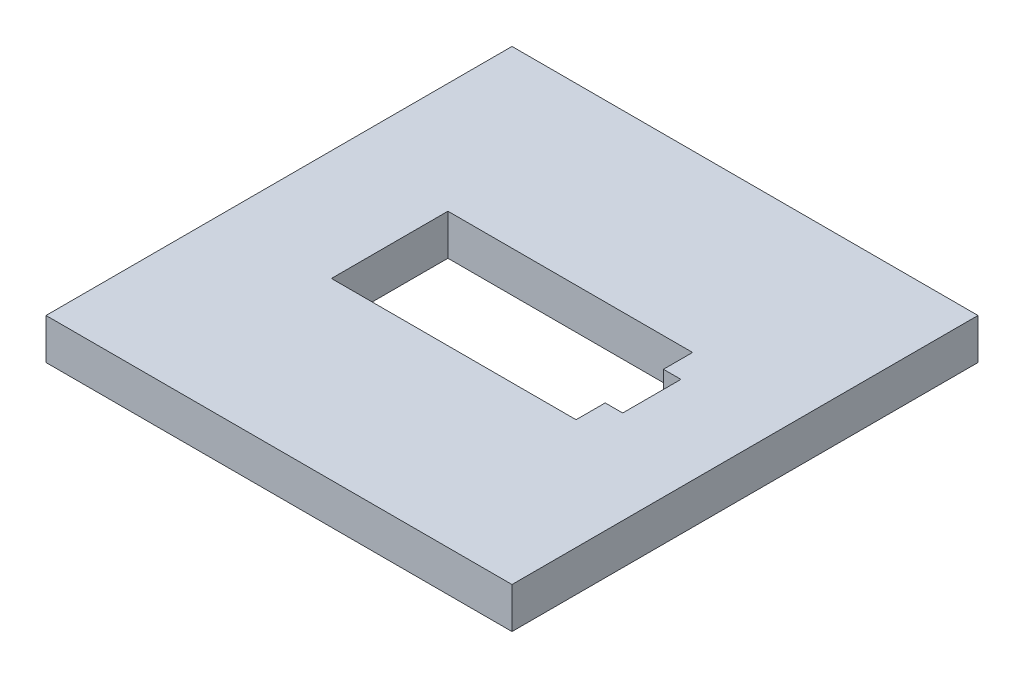
ISO-10303-21;
HEADER;
FILE_DESCRIPTION(('STEP AP214'),'2;1');
FILE_NAME('part.step','',(''),(''),'','','');
FILE_SCHEMA(('AUTOMOTIVE_DESIGN { 1 0 10303 214 1 1 1 1 }'));
ENDSEC;
DATA;
#1=APPLICATION_CONTEXT('core data for automotive mechanical design processes');
#2=APPLICATION_PROTOCOL_DEFINITION('international standard','automotive_design',2000,#1);
#3=PRODUCT_CONTEXT('',#1,'mechanical');
#4=PRODUCT('Part','Part','',(#3));
#5=PRODUCT_RELATED_PRODUCT_CATEGORY('part','',(#4));
#6=PRODUCT_DEFINITION_FORMATION('','',#4);
#7=PRODUCT_DEFINITION_CONTEXT('part definition',#1,'design');
#8=PRODUCT_DEFINITION('design','',#6,#7);
#9=PRODUCT_DEFINITION_SHAPE('','',#8);
#10=(LENGTH_UNIT() NAMED_UNIT(*) SI_UNIT(.MILLI.,.METRE.));
#11=(NAMED_UNIT(*) PLANE_ANGLE_UNIT() SI_UNIT($,.RADIAN.));
#12=(NAMED_UNIT(*) SI_UNIT($,.STERADIAN.) SOLID_ANGLE_UNIT());
#13=UNCERTAINTY_MEASURE_WITH_UNIT(LENGTH_MEASURE(1.E-05),#10,'distance_accuracy_value','');
#14=(GEOMETRIC_REPRESENTATION_CONTEXT(3) GLOBAL_UNCERTAINTY_ASSIGNED_CONTEXT((#13)) GLOBAL_UNIT_ASSIGNED_CONTEXT((#10,
#11,#12)) REPRESENTATION_CONTEXT('',''));
#15=CARTESIAN_POINT('',(0.,0.,0.));
#16=DIRECTION('',(0.,0.,1.));
#17=DIRECTION('',(1.,0.,0.));
#18=AXIS2_PLACEMENT_3D('',#15,#16,#17);
#19=CARTESIAN_POINT('',(40.,7.,40.));
#20=DIRECTION('',(-1.,0.,0.));
#21=DIRECTION('',(0.,0.,1.));
#22=AXIS2_PLACEMENT_3D('',#19,#20,#21);
#23=PLANE('',#22);
#24=DIRECTION('',(0.,0.,-1.));
#25=VECTOR('',#24,1.);
#26=CARTESIAN_POINT('',(40.,0.,40.));
#27=LINE('',#26,#25);
#28=CARTESIAN_POINT('',(40.,0.,40.));
#29=VERTEX_POINT('',#28);
#30=CARTESIAN_POINT('',(40.,0.,-40.));
#31=VERTEX_POINT('',#30);
#32=EDGE_CURVE('E184',#29,#31,#27,.T.);
#33=ORIENTED_EDGE('',*,*,#32,.T.);
#34=DIRECTION('',(0.,-1.,0.));
#35=VECTOR('',#34,1.);
#36=CARTESIAN_POINT('',(40.,7.,-40.));
#37=LINE('',#36,#35);
#38=CARTESIAN_POINT('',(40.,7.,-40.));
#39=VERTEX_POINT('',#38);
#40=EDGE_CURVE('E11',#39,#31,#37,.T.);
#41=ORIENTED_EDGE('',*,*,#40,.F.);
#42=DIRECTION('',(0.,0.,-1.));
#43=VECTOR('',#42,1.);
#44=CARTESIAN_POINT('',(40.,7.,40.));
#45=LINE('',#44,#43);
#46=CARTESIAN_POINT('',(40.,7.,40.));
#47=VERTEX_POINT('',#46);
#48=EDGE_CURVE('E196',#47,#39,#45,.T.);
#49=ORIENTED_EDGE('',*,*,#48,.F.);
#50=DIRECTION('',(0.,-1.,0.));
#51=VECTOR('',#50,1.);
#52=CARTESIAN_POINT('',(40.,7.,40.));
#53=LINE('',#52,#51);
#54=EDGE_CURVE('E206',#47,#29,#53,.T.);
#55=ORIENTED_EDGE('',*,*,#54,.T.);
#56=EDGE_LOOP('',(#33,#41,#49,#55));
#57=FACE_BOUND('',#56,.T.);
#58=ADVANCED_FACE('F39',(#57),#23,.F.);
#59=CARTESIAN_POINT('',(-40.,7.,-40.));
#60=DIRECTION('',(0.,0.,1.));
#61=DIRECTION('',(1.,0.,0.));
#62=AXIS2_PLACEMENT_3D('',#59,#60,#61);
#63=PLANE('',#62);
#64=DIRECTION('',(-1.,0.,0.));
#65=VECTOR('',#64,1.);
#66=CARTESIAN_POINT('',(-40.,0.,-40.));
#67=LINE('',#66,#65);
#68=CARTESIAN_POINT('',(-40.,0.,-40.));
#69=VERTEX_POINT('',#68);
#70=EDGE_CURVE('E209',#31,#69,#67,.T.);
#71=ORIENTED_EDGE('',*,*,#70,.T.);
#72=DIRECTION('',(0.,-1.,0.));
#73=VECTOR('',#72,1.);
#74=CARTESIAN_POINT('',(-40.,7.,-40.));
#75=LINE('',#74,#73);
#76=CARTESIAN_POINT('',(-40.,7.,-40.));
#77=VERTEX_POINT('',#76);
#78=EDGE_CURVE('E46',#77,#69,#75,.T.);
#79=ORIENTED_EDGE('',*,*,#78,.F.);
#80=DIRECTION('',(-1.,0.,0.));
#81=VECTOR('',#80,1.);
#82=CARTESIAN_POINT('',(-40.,7.,-40.));
#83=LINE('',#82,#81);
#84=EDGE_CURVE('E199',#39,#77,#83,.T.);
#85=ORIENTED_EDGE('',*,*,#84,.F.);
#86=ORIENTED_EDGE('',*,*,#40,.T.);
#87=EDGE_LOOP('',(#71,#79,#85,#86));
#88=FACE_BOUND('',#87,.T.);
#89=ADVANCED_FACE('F237',(#88),#63,.F.);
#90=CARTESIAN_POINT('',(-40.,7.,40.));
#91=DIRECTION('',(1.,0.,0.));
#92=DIRECTION('',(0.,0.,-1.));
#93=AXIS2_PLACEMENT_3D('',#90,#91,#92);
#94=PLANE('',#93);
#95=DIRECTION('',(0.,0.,1.));
#96=VECTOR('',#95,1.);
#97=CARTESIAN_POINT('',(-40.,0.,40.));
#98=LINE('',#97,#96);
#99=CARTESIAN_POINT('',(-40.,0.,40.));
#100=VERTEX_POINT('',#99);
#101=EDGE_CURVE('E211',#69,#100,#98,.T.);
#102=ORIENTED_EDGE('',*,*,#101,.T.);
#103=DIRECTION('',(0.,-1.,0.));
#104=VECTOR('',#103,1.);
#105=CARTESIAN_POINT('',(-40.,7.,40.));
#106=LINE('',#105,#104);
#107=CARTESIAN_POINT('',(-40.,7.,40.));
#108=VERTEX_POINT('',#107);
#109=EDGE_CURVE('E216',#108,#100,#106,.T.);
#110=ORIENTED_EDGE('',*,*,#109,.F.);
#111=DIRECTION('',(0.,0.,1.));
#112=VECTOR('',#111,1.);
#113=CARTESIAN_POINT('',(-40.,7.,40.));
#114=LINE('',#113,#112);
#115=EDGE_CURVE('E202',#77,#108,#114,.T.);
#116=ORIENTED_EDGE('',*,*,#115,.F.);
#117=ORIENTED_EDGE('',*,*,#78,.T.);
#118=EDGE_LOOP('',(#102,#110,#116,#117));
#119=FACE_BOUND('',#118,.T.);
#120=ADVANCED_FACE('F223',(#119),#94,.F.);
#121=CARTESIAN_POINT('',(-40.,7.,40.));
#122=DIRECTION('',(0.,0.,-1.));
#123=DIRECTION('',(-1.,0.,0.));
#124=AXIS2_PLACEMENT_3D('',#121,#122,#123);
#125=PLANE('',#124);
#126=DIRECTION('',(1.,0.,0.));
#127=VECTOR('',#126,1.);
#128=CARTESIAN_POINT('',(-40.,0.,40.));
#129=LINE('',#128,#127);
#130=EDGE_CURVE('E200',#100,#29,#129,.T.);
#131=ORIENTED_EDGE('',*,*,#130,.T.);
#132=ORIENTED_EDGE('',*,*,#54,.F.);
#133=DIRECTION('',(1.,0.,0.));
#134=VECTOR('',#133,1.);
#135=CARTESIAN_POINT('',(-40.,7.,40.));
#136=LINE('',#135,#134);
#137=EDGE_CURVE('E204',#108,#47,#136,.T.);
#138=ORIENTED_EDGE('',*,*,#137,.F.);
#139=ORIENTED_EDGE('',*,*,#109,.T.);
#140=EDGE_LOOP('',(#131,#132,#138,#139));
#141=FACE_BOUND('',#140,.T.);
#142=ADVANCED_FACE('F230',(#141),#125,.F.);
#143=CARTESIAN_POINT('',(0.,7.,0.));
#144=DIRECTION('',(0.,-1.,0.));
#145=DIRECTION('',(0.,0.,-1.));
#146=AXIS2_PLACEMENT_3D('',#143,#144,#145);
#147=PLANE('',#146);
#148=DIRECTION('',(-1.,0.,0.));
#149=VECTOR('',#148,1.);
#150=CARTESIAN_POINT('',(-21.,7.,-10.));
#151=LINE('',#150,#149);
#152=CARTESIAN_POINT('',(21.,7.,-10.));
#153=VERTEX_POINT('',#152);
#154=CARTESIAN_POINT('',(-21.,7.,-10.));
#155=VERTEX_POINT('',#154);
#156=EDGE_CURVE('E166',#153,#155,#151,.T.);
#157=ORIENTED_EDGE('',*,*,#156,.F.);
#158=DIRECTION('',(0.,0.,-1.));
#159=VECTOR('',#158,1.);
#160=CARTESIAN_POINT('',(21.,7.,-5.));
#161=LINE('',#160,#159);
#162=CARTESIAN_POINT('',(21.,7.,-5.));
#163=VERTEX_POINT('',#162);
#164=EDGE_CURVE('E53',#163,#153,#161,.T.);
#165=ORIENTED_EDGE('',*,*,#164,.F.);
#166=DIRECTION('',(-1.,0.,0.));
#167=VECTOR('',#166,1.);
#168=CARTESIAN_POINT('',(21.,7.,-5.));
#169=LINE('',#168,#167);
#170=CARTESIAN_POINT('',(24.,7.,-5.));
#171=VERTEX_POINT('',#170);
#172=EDGE_CURVE('E146',#171,#163,#169,.T.);
#173=ORIENTED_EDGE('',*,*,#172,.F.);
#174=DIRECTION('',(0.,0.,-1.));
#175=VECTOR('',#174,1.);
#176=CARTESIAN_POINT('',(24.,7.,-5.));
#177=LINE('',#176,#175);
#178=CARTESIAN_POINT('',(24.,7.,5.));
#179=VERTEX_POINT('',#178);
#180=EDGE_CURVE('E149',#179,#171,#177,.T.);
#181=ORIENTED_EDGE('',*,*,#180,.F.);
#182=DIRECTION('',(1.,0.,0.));
#183=VECTOR('',#182,1.);
#184=CARTESIAN_POINT('',(24.,7.,5.));
#185=LINE('',#184,#183);
#186=CARTESIAN_POINT('',(21.,7.,5.));
#187=VERTEX_POINT('',#186);
#188=EDGE_CURVE('E177',#187,#179,#185,.T.);
#189=ORIENTED_EDGE('',*,*,#188,.F.);
#190=DIRECTION('',(0.,0.,-1.));
#191=VECTOR('',#190,1.);
#192=CARTESIAN_POINT('',(21.,7.,10.));
#193=LINE('',#192,#191);
#194=CARTESIAN_POINT('',(21.,7.,10.));
#195=VERTEX_POINT('',#194);
#196=EDGE_CURVE('E174',#195,#187,#193,.T.);
#197=ORIENTED_EDGE('',*,*,#196,.F.);
#198=DIRECTION('',(1.,0.,0.));
#199=VECTOR('',#198,1.);
#200=CARTESIAN_POINT('',(-21.,7.,10.));
#201=LINE('',#200,#199);
#202=CARTESIAN_POINT('',(-21.,7.,10.));
#203=VERTEX_POINT('',#202);
#204=EDGE_CURVE('E171',#203,#195,#201,.T.);
#205=ORIENTED_EDGE('',*,*,#204,.F.);
#206=DIRECTION('',(0.,0.,1.));
#207=VECTOR('',#206,1.);
#208=CARTESIAN_POINT('',(-21.,7.,10.));
#209=LINE('',#208,#207);
#210=EDGE_CURVE('E168',#155,#203,#209,.T.);
#211=ORIENTED_EDGE('',*,*,#210,.F.);
#212=EDGE_LOOP('',(#157,#165,#173,#181,#189,#197,#205,#211));
#213=FACE_BOUND('',#212,.T.);
#214=ORIENTED_EDGE('',*,*,#48,.T.);
#215=ORIENTED_EDGE('',*,*,#84,.T.);
#216=ORIENTED_EDGE('',*,*,#115,.T.);
#217=ORIENTED_EDGE('',*,*,#137,.T.);
#218=EDGE_LOOP('',(#214,#215,#216,#217));
#219=FACE_BOUND('',#218,.T.);
#220=ADVANCED_FACE('F236',(#213,#219),#147,.F.);
#221=CARTESIAN_POINT('',(0.,0.,0.));
#222=DIRECTION('',(0.,-1.,0.));
#223=DIRECTION('',(0.,0.,-1.));
#224=AXIS2_PLACEMENT_3D('',#221,#222,#223);
#225=PLANE('',#224);
#226=DIRECTION('',(0.,0.,-1.));
#227=VECTOR('',#226,1.);
#228=CARTESIAN_POINT('',(21.,0.,-5.));
#229=LINE('',#228,#227);
#230=CARTESIAN_POINT('',(21.,0.,-5.));
#231=VERTEX_POINT('',#230);
#232=CARTESIAN_POINT('',(21.,0.,-10.));
#233=VERTEX_POINT('',#232);
#234=EDGE_CURVE('E129',#231,#233,#229,.T.);
#235=ORIENTED_EDGE('',*,*,#234,.T.);
#236=DIRECTION('',(-1.,0.,0.));
#237=VECTOR('',#236,1.);
#238=CARTESIAN_POINT('',(-21.,0.,-10.));
#239=LINE('',#238,#237);
#240=CARTESIAN_POINT('',(-21.,0.,-10.));
#241=VERTEX_POINT('',#240);
#242=EDGE_CURVE('E138',#233,#241,#239,.T.);
#243=ORIENTED_EDGE('',*,*,#242,.T.);
#244=DIRECTION('',(0.,0.,1.));
#245=VECTOR('',#244,1.);
#246=CARTESIAN_POINT('',(-21.,0.,10.));
#247=LINE('',#246,#245);
#248=CARTESIAN_POINT('',(-21.,0.,10.));
#249=VERTEX_POINT('',#248);
#250=EDGE_CURVE('E61',#241,#249,#247,.T.);
#251=ORIENTED_EDGE('',*,*,#250,.T.);
#252=DIRECTION('',(1.,0.,0.));
#253=VECTOR('',#252,1.);
#254=CARTESIAN_POINT('',(-21.,0.,10.));
#255=LINE('',#254,#253);
#256=CARTESIAN_POINT('',(21.,0.,10.));
#257=VERTEX_POINT('',#256);
#258=EDGE_CURVE('E153',#249,#257,#255,.T.);
#259=ORIENTED_EDGE('',*,*,#258,.T.);
#260=DIRECTION('',(0.,0.,-1.));
#261=VECTOR('',#260,1.);
#262=CARTESIAN_POINT('',(21.,0.,10.));
#263=LINE('',#262,#261);
#264=CARTESIAN_POINT('',(21.,0.,5.));
#265=VERTEX_POINT('',#264);
#266=EDGE_CURVE('E156',#257,#265,#263,.T.);
#267=ORIENTED_EDGE('',*,*,#266,.T.);
#268=DIRECTION('',(1.,0.,0.));
#269=VECTOR('',#268,1.);
#270=CARTESIAN_POINT('',(24.,0.,5.));
#271=LINE('',#270,#269);
#272=CARTESIAN_POINT('',(24.,0.,5.));
#273=VERTEX_POINT('',#272);
#274=EDGE_CURVE('E159',#265,#273,#271,.T.);
#275=ORIENTED_EDGE('',*,*,#274,.T.);
#276=DIRECTION('',(0.,0.,-1.));
#277=VECTOR('',#276,1.);
#278=CARTESIAN_POINT('',(24.,0.,-5.));
#279=LINE('',#278,#277);
#280=CARTESIAN_POINT('',(24.,0.,-5.));
#281=VERTEX_POINT('',#280);
#282=EDGE_CURVE('E162',#273,#281,#279,.T.);
#283=ORIENTED_EDGE('',*,*,#282,.T.);
#284=DIRECTION('',(-1.,0.,0.));
#285=VECTOR('',#284,1.);
#286=CARTESIAN_POINT('',(21.,0.,-5.));
#287=LINE('',#286,#285);
#288=EDGE_CURVE('E135',#281,#231,#287,.T.);
#289=ORIENTED_EDGE('',*,*,#288,.T.);
#290=EDGE_LOOP('',(#235,#243,#251,#259,#267,#275,#283,#289));
#291=FACE_BOUND('',#290,.T.);
#292=ORIENTED_EDGE('',*,*,#32,.F.);
#293=ORIENTED_EDGE('',*,*,#130,.F.);
#294=ORIENTED_EDGE('',*,*,#101,.F.);
#295=ORIENTED_EDGE('',*,*,#70,.F.);
#296=EDGE_LOOP('',(#292,#293,#294,#295));
#297=FACE_BOUND('',#296,.T.);
#298=ADVANCED_FACE('F142',(#291,#297),#225,.T.);
#299=CARTESIAN_POINT('',(21.,0.,-5.));
#300=DIRECTION('',(1.,0.,0.));
#301=DIRECTION('',(0.,0.,-1.));
#302=AXIS2_PLACEMENT_3D('',#299,#300,#301);
#303=PLANE('',#302);
#304=ORIENTED_EDGE('',*,*,#164,.T.);
#305=DIRECTION('',(0.,1.,0.));
#306=VECTOR('',#305,1.);
#307=CARTESIAN_POINT('',(21.,0.,-10.));
#308=LINE('',#307,#306);
#309=EDGE_CURVE('E125',#233,#153,#308,.T.);
#310=ORIENTED_EDGE('',*,*,#309,.F.);
#311=ORIENTED_EDGE('',*,*,#234,.F.);
#312=DIRECTION('',(0.,1.,0.));
#313=VECTOR('',#312,1.);
#314=CARTESIAN_POINT('',(21.,0.,-5.));
#315=LINE('',#314,#313);
#316=EDGE_CURVE('E182',#231,#163,#315,.T.);
#317=ORIENTED_EDGE('',*,*,#316,.T.);
#318=EDGE_LOOP('',(#304,#310,#311,#317));
#319=FACE_BOUND('',#318,.T.);
#320=ADVANCED_FACE('F127',(#319),#303,.F.);
#321=CARTESIAN_POINT('',(21.,0.,-5.));
#322=DIRECTION('',(0.,0.,-1.));
#323=DIRECTION('',(-1.,0.,0.));
#324=AXIS2_PLACEMENT_3D('',#321,#322,#323);
#325=PLANE('',#324);
#326=ORIENTED_EDGE('',*,*,#172,.T.);
#327=ORIENTED_EDGE('',*,*,#316,.F.);
#328=ORIENTED_EDGE('',*,*,#288,.F.);
#329=DIRECTION('',(0.,1.,0.));
#330=VECTOR('',#329,1.);
#331=CARTESIAN_POINT('',(24.,0.,-5.));
#332=LINE('',#331,#330);
#333=EDGE_CURVE('E185',#281,#171,#332,.T.);
#334=ORIENTED_EDGE('',*,*,#333,.T.);
#335=EDGE_LOOP('',(#326,#327,#328,#334));
#336=FACE_BOUND('',#335,.T.);
#337=ADVANCED_FACE('F254',(#336),#325,.F.);
#338=CARTESIAN_POINT('',(24.,0.,-5.));
#339=DIRECTION('',(1.,0.,0.));
#340=DIRECTION('',(0.,0.,-1.));
#341=AXIS2_PLACEMENT_3D('',#338,#339,#340);
#342=PLANE('',#341);
#343=ORIENTED_EDGE('',*,*,#180,.T.);
#344=ORIENTED_EDGE('',*,*,#333,.F.);
#345=ORIENTED_EDGE('',*,*,#282,.F.);
#346=DIRECTION('',(0.,1.,0.));
#347=VECTOR('',#346,1.);
#348=CARTESIAN_POINT('',(24.,0.,5.));
#349=LINE('',#348,#347);
#350=EDGE_CURVE('E187',#273,#179,#349,.T.);
#351=ORIENTED_EDGE('',*,*,#350,.T.);
#352=EDGE_LOOP('',(#343,#344,#345,#351));
#353=FACE_BOUND('',#352,.T.);
#354=ADVANCED_FACE('F271',(#353),#342,.F.);
#355=CARTESIAN_POINT('',(24.,0.,5.));
#356=DIRECTION('',(0.,0.,1.));
#357=DIRECTION('',(1.,0.,0.));
#358=AXIS2_PLACEMENT_3D('',#355,#356,#357);
#359=PLANE('',#358);
#360=ORIENTED_EDGE('',*,*,#188,.T.);
#361=ORIENTED_EDGE('',*,*,#350,.F.);
#362=ORIENTED_EDGE('',*,*,#274,.F.);
#363=DIRECTION('',(0.,1.,0.));
#364=VECTOR('',#363,1.);
#365=CARTESIAN_POINT('',(21.,0.,5.));
#366=LINE('',#365,#364);
#367=EDGE_CURVE('E189',#265,#187,#366,.T.);
#368=ORIENTED_EDGE('',*,*,#367,.T.);
#369=EDGE_LOOP('',(#360,#361,#362,#368));
#370=FACE_BOUND('',#369,.T.);
#371=ADVANCED_FACE('F267',(#370),#359,.F.);
#372=CARTESIAN_POINT('',(21.,0.,10.));
#373=DIRECTION('',(1.,0.,0.));
#374=DIRECTION('',(0.,0.,-1.));
#375=AXIS2_PLACEMENT_3D('',#372,#373,#374);
#376=PLANE('',#375);
#377=ORIENTED_EDGE('',*,*,#196,.T.);
#378=ORIENTED_EDGE('',*,*,#367,.F.);
#379=ORIENTED_EDGE('',*,*,#266,.F.);
#380=DIRECTION('',(0.,1.,0.));
#381=VECTOR('',#380,1.);
#382=CARTESIAN_POINT('',(21.,0.,10.));
#383=LINE('',#382,#381);
#384=EDGE_CURVE('E191',#257,#195,#383,.T.);
#385=ORIENTED_EDGE('',*,*,#384,.T.);
#386=EDGE_LOOP('',(#377,#378,#379,#385));
#387=FACE_BOUND('',#386,.T.);
#388=ADVANCED_FACE('F263',(#387),#376,.F.);
#389=CARTESIAN_POINT('',(-21.,0.,10.));
#390=DIRECTION('',(0.,0.,1.));
#391=DIRECTION('',(1.,0.,0.));
#392=AXIS2_PLACEMENT_3D('',#389,#390,#391);
#393=PLANE('',#392);
#394=ORIENTED_EDGE('',*,*,#204,.T.);
#395=ORIENTED_EDGE('',*,*,#384,.F.);
#396=ORIENTED_EDGE('',*,*,#258,.F.);
#397=DIRECTION('',(0.,1.,0.));
#398=VECTOR('',#397,1.);
#399=CARTESIAN_POINT('',(-21.,0.,10.));
#400=LINE('',#399,#398);
#401=EDGE_CURVE('E193',#249,#203,#400,.T.);
#402=ORIENTED_EDGE('',*,*,#401,.T.);
#403=EDGE_LOOP('',(#394,#395,#396,#402));
#404=FACE_BOUND('',#403,.T.);
#405=ADVANCED_FACE('F260',(#404),#393,.F.);
#406=CARTESIAN_POINT('',(-21.,0.,10.));
#407=DIRECTION('',(-1.,0.,0.));
#408=DIRECTION('',(0.,0.,1.));
#409=AXIS2_PLACEMENT_3D('',#406,#407,#408);
#410=PLANE('',#409);
#411=ORIENTED_EDGE('',*,*,#210,.T.);
#412=ORIENTED_EDGE('',*,*,#401,.F.);
#413=ORIENTED_EDGE('',*,*,#250,.F.);
#414=DIRECTION('',(0.,1.,0.));
#415=VECTOR('',#414,1.);
#416=CARTESIAN_POINT('',(-21.,0.,-10.));
#417=LINE('',#416,#415);
#418=EDGE_CURVE('E134',#241,#155,#417,.T.);
#419=ORIENTED_EDGE('',*,*,#418,.T.);
#420=EDGE_LOOP('',(#411,#412,#413,#419));
#421=FACE_BOUND('',#420,.T.);
#422=ADVANCED_FACE('F257',(#421),#410,.F.);
#423=CARTESIAN_POINT('',(-21.,0.,-10.));
#424=DIRECTION('',(0.,0.,-1.));
#425=DIRECTION('',(-1.,0.,0.));
#426=AXIS2_PLACEMENT_3D('',#423,#424,#425);
#427=PLANE('',#426);
#428=ORIENTED_EDGE('',*,*,#156,.T.);
#429=ORIENTED_EDGE('',*,*,#418,.F.);
#430=ORIENTED_EDGE('',*,*,#242,.F.);
#431=ORIENTED_EDGE('',*,*,#309,.T.);
#432=EDGE_LOOP('',(#428,#429,#430,#431));
#433=FACE_BOUND('',#432,.T.);
#434=ADVANCED_FACE('F139',(#433),#427,.F.);
#435=CLOSED_SHELL('',(#58,#89,#120,#142,#220,#298,#320,#337,#354,#371,#388,#405,#422,#434));
#436=MANIFOLD_SOLID_BREP('B2',#435);
#437=ADVANCED_BREP_SHAPE_REPRESENTATION('',(#18,#436),#14);
#438=SHAPE_DEFINITION_REPRESENTATION(#9,#437);
ENDSEC;
END-ISO-10303-21;
